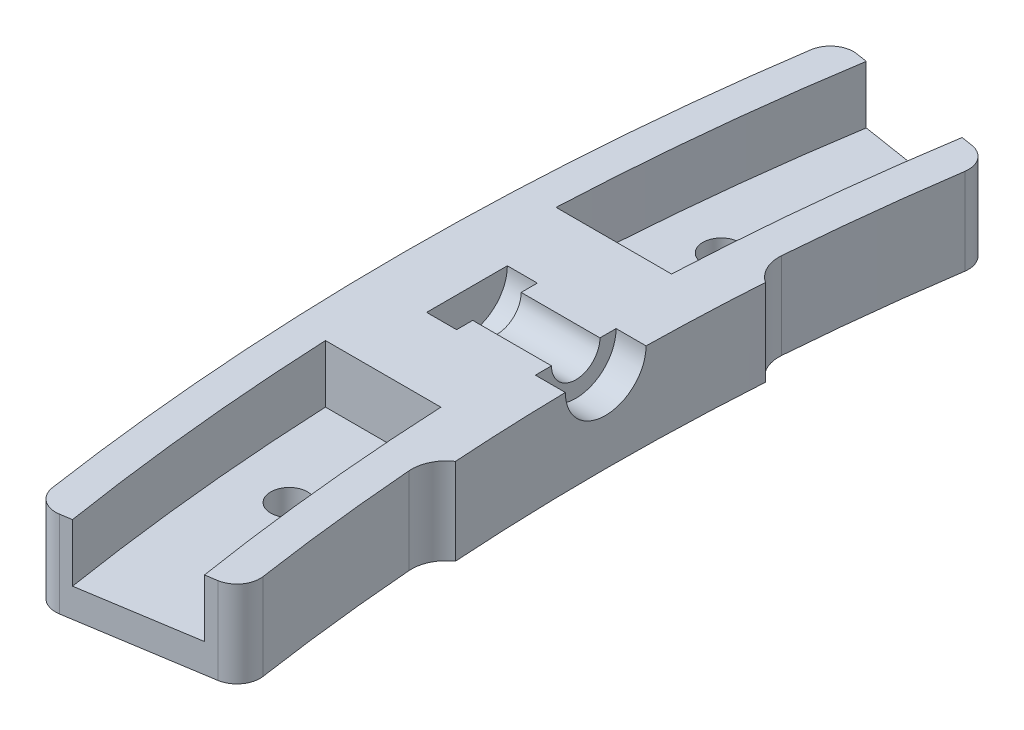
ISO-10303-21;
HEADER;
FILE_DESCRIPTION(('STEP AP214'),'2;1');
FILE_NAME('part.step','',(''),(''),'','','');
FILE_SCHEMA(('AUTOMOTIVE_DESIGN { 1 0 10303 214 1 1 1 1 }'));
ENDSEC;
DATA;
#1=APPLICATION_CONTEXT('core data for automotive mechanical design processes');
#2=APPLICATION_PROTOCOL_DEFINITION('international standard','automotive_design',2000,#1);
#3=PRODUCT_CONTEXT('',#1,'mechanical');
#4=PRODUCT('Part','Part','',(#3));
#5=PRODUCT_RELATED_PRODUCT_CATEGORY('part','',(#4));
#6=PRODUCT_DEFINITION_FORMATION('','',#4);
#7=PRODUCT_DEFINITION_CONTEXT('part definition',#1,'design');
#8=PRODUCT_DEFINITION('design','',#6,#7);
#9=PRODUCT_DEFINITION_SHAPE('','',#8);
#10=(LENGTH_UNIT() NAMED_UNIT(*) SI_UNIT(.MILLI.,.METRE.));
#11=(NAMED_UNIT(*) PLANE_ANGLE_UNIT() SI_UNIT($,.RADIAN.));
#12=(NAMED_UNIT(*) SI_UNIT($,.STERADIAN.) SOLID_ANGLE_UNIT());
#13=UNCERTAINTY_MEASURE_WITH_UNIT(LENGTH_MEASURE(1.E-05),#10,'distance_accuracy_value','');
#14=(GEOMETRIC_REPRESENTATION_CONTEXT(3) GLOBAL_UNCERTAINTY_ASSIGNED_CONTEXT((#13)) GLOBAL_UNIT_ASSIGNED_CONTEXT((#10,
#11,#12)) REPRESENTATION_CONTEXT('',''));
#15=CARTESIAN_POINT('',(0.,0.,0.));
#16=DIRECTION('',(0.,0.,1.));
#17=DIRECTION('',(1.,0.,0.));
#18=AXIS2_PLACEMENT_3D('',#15,#16,#17);
#19=CARTESIAN_POINT('',(0.,10.0000000000001,0.));
#20=DIRECTION('',(0.,-1.00000000000001,0.));
#21=DIRECTION('',(0.,0.,-1.00000000000001));
#22=AXIS2_PLACEMENT_3D('',#19,#20,#21);
#23=CYLINDRICAL_SURFACE('',#22,207.);
#24=DIRECTION('',(0.,-1.00000000000001,0.));
#25=VECTOR('',#24,1.);
#26=CARTESIAN_POINT('',(-206.36838062626,10.0000000000001,-16.1583253369565));
#27=LINE('',#26,#25);
#28=CARTESIAN_POINT('',(-206.36838062626,10.0000000000001,-16.1583253369565));
#29=VERTEX_POINT('',#28);
#30=CARTESIAN_POINT('',(-206.36838062626,2.50000000000003,-16.1583253369564));
#31=VERTEX_POINT('',#30);
#32=EDGE_CURVE('E468',#29,#31,#27,.T.);
#33=ORIENTED_EDGE('',*,*,#32,.T.);
#34=CARTESIAN_POINT('',(0.,2.50000000000001,0.));
#35=DIRECTION('',(0.,1.00000000000001,0.));
#36=DIRECTION('',(0.,0.,-1.00000000000001));
#37=AXIS2_PLACEMENT_3D('',#34,#35,#36);
#38=CIRCLE('',#37,207.);
#39=CARTESIAN_POINT('',(-204.752000140416,2.50000000000001,-30.4239780189755));
#40=VERTEX_POINT('',#39);
#41=EDGE_CURVE('E374',#40,#31,#38,.T.);
#42=ORIENTED_EDGE('',*,*,#41,.F.);
#43=DIRECTION('',(0.,-1.00000000000001,0.));
#44=VECTOR('',#43,1.);
#45=CARTESIAN_POINT('',(-204.752000140416,10.0000000000001,-30.4239780189755));
#46=LINE('',#45,#44);
#47=CARTESIAN_POINT('',(-204.752000140416,10.0000000000001,-30.4239780189755));
#48=VERTEX_POINT('',#47);
#49=EDGE_CURVE('E349',#40,#48,#46,.F.);
#50=ORIENTED_EDGE('',*,*,#49,.T.);
#51=CARTESIAN_POINT('',(0.,10.0000000000001,0.));
#52=DIRECTION('',(0.,1.00000000000001,0.));
#53=DIRECTION('',(0.,0.,1.00000000000001));
#54=AXIS2_PLACEMENT_3D('',#51,#52,#53);
#55=CIRCLE('',#54,207.);
#56=EDGE_CURVE('E460',#48,#29,#55,.T.);
#57=ORIENTED_EDGE('',*,*,#56,.T.);
#58=EDGE_LOOP('',(#33,#42,#50,#57));
#59=FACE_BOUND('',#58,.T.);
#60=ADVANCED_FACE('F35',(#59),#23,.F.);
#61=DIRECTION('',(0.,-1.00000000000001,0.));
#62=VECTOR('',#61,1.);
#63=CARTESIAN_POINT('',(-204.752000140416,10.0000000000001,30.4239780189756));
#64=LINE('',#63,#62);
#65=CARTESIAN_POINT('',(-204.752000140416,10.0000000000001,30.4239780189756));
#66=VERTEX_POINT('',#65);
#67=CARTESIAN_POINT('',(-204.752000140416,2.50000000000002,30.4239780189755));
#68=VERTEX_POINT('',#67);
#69=EDGE_CURVE('E342',#66,#68,#64,.T.);
#70=ORIENTED_EDGE('',*,*,#69,.T.);
#71=CARTESIAN_POINT('',(0.,2.50000000000001,0.));
#72=DIRECTION('',(0.,1.00000000000001,0.));
#73=DIRECTION('',(0.,0.,-1.00000000000001));
#74=AXIS2_PLACEMENT_3D('',#71,#72,#73);
#75=CIRCLE('',#74,207.);
#76=CARTESIAN_POINT('',(-206.36838062626,2.50000000000004,16.1583253369557));
#77=VERTEX_POINT('',#76);
#78=EDGE_CURVE('E359',#77,#68,#75,.T.);
#79=ORIENTED_EDGE('',*,*,#78,.F.);
#80=DIRECTION('',(0.,-1.00000000000001,0.));
#81=VECTOR('',#80,1.);
#82=CARTESIAN_POINT('',(-206.36838062626,10.0000000000001,16.1583253369557));
#83=LINE('',#82,#81);
#84=CARTESIAN_POINT('',(-206.36838062626,10.0000000000001,16.1583253369557));
#85=VERTEX_POINT('',#84);
#86=EDGE_CURVE('E472',#77,#85,#83,.F.);
#87=ORIENTED_EDGE('',*,*,#86,.T.);
#88=EDGE_CURVE('E459',#85,#66,#55,.T.);
#89=ORIENTED_EDGE('',*,*,#88,.T.);
#90=EDGE_LOOP('',(#70,#79,#87,#89));
#91=FACE_BOUND('',#90,.T.);
#92=ADVANCED_FACE('F290',(#91),#23,.F.);
#93=CARTESIAN_POINT('',(0.,10.0000000000001,0.));
#94=DIRECTION('',(0.156434465040234,0.,0.987688340595146));
#95=DIRECTION('',(0.987688340595137,0.,-0.156434465040235));
#96=AXIS2_PLACEMENT_3D('',#93,#94,#95);
#97=PLANE('',#96);
#98=DIRECTION('',(0.,1.00000000000001,0.));
#99=VECTOR('',#98,1.);
#100=CARTESIAN_POINT('',(-218.270184732485,0.,34.5706010483888));
#101=LINE('',#100,#99);
#102=CARTESIAN_POINT('',(-218.270184732485,10.0000000000001,34.5706010483888));
#103=VERTEX_POINT('',#102);
#104=CARTESIAN_POINT('',(-218.270184732485,2.50000000000003,34.5706010483887));
#105=VERTEX_POINT('',#104);
#106=EDGE_CURVE('E338',#103,#105,#101,.F.);
#107=ORIENTED_EDGE('',*,*,#106,.T.);
#108=DIRECTION('',(-0.987688340595137,0.,0.156434465040234));
#109=VECTOR('',#108,1.);
#110=CARTESIAN_POINT('',(-206.417411404929,2.50000000000003,32.6933061786101));
#111=LINE('',#110,#109);
#112=CARTESIAN_POINT('',(-206.417411404929,2.50000000000003,32.6933061786101));
#113=VERTEX_POINT('',#112);
#114=EDGE_CURVE('E362',#113,#105,#111,.T.);
#115=ORIENTED_EDGE('',*,*,#114,.F.);
#116=DIRECTION('',(0.,-1.00000000000001,0.));
#117=VECTOR('',#116,1.);
#118=CARTESIAN_POINT('',(-206.417411404929,10.0000000000001,32.6933061786101));
#119=LINE('',#118,#117);
#120=CARTESIAN_POINT('',(-206.417411404929,10.0000000000001,32.6933061786101));
#121=VERTEX_POINT('',#120);
#122=EDGE_CURVE('E331',#113,#121,#119,.F.);
#123=ORIENTED_EDGE('',*,*,#122,.T.);
#124=DIRECTION('',(-0.987688340595137,0.,0.156434465040235));
#125=VECTOR('',#124,1.);
#126=CARTESIAN_POINT('',(0.,10.0000000000001,0.));
#127=LINE('',#126,#125);
#128=CARTESIAN_POINT('',(-207.414551524979,10.0000000000001,32.8512376584494));
#129=VERTEX_POINT('',#128);
#130=EDGE_CURVE('E457',#121,#129,#127,.T.);
#131=ORIENTED_EDGE('',*,*,#130,.T.);
#132=DIRECTION('',(0.,1.00000000000001,0.));
#133=VECTOR('',#132,1.);
#134=CARTESIAN_POINT('',(-207.414551524979,5.00000000000004,32.8512376584493));
#135=LINE('',#134,#133);
#136=CARTESIAN_POINT('',(-207.414551524979,5.00000000000004,32.8512376584493));
#137=VERTEX_POINT('',#136);
#138=EDGE_CURVE('E449',#137,#129,#135,.T.);
#139=ORIENTED_EDGE('',*,*,#138,.F.);
#140=DIRECTION('',(0.987688340595137,0.,-0.156434465040235));
#141=VECTOR('',#140,1.);
#142=CARTESIAN_POINT('',(0.,5.00000000000004,0.));
#143=LINE('',#142,#141);
#144=CARTESIAN_POINT('',(-217.29143493093,5.00000000000005,34.4155823088518));
#145=VERTEX_POINT('',#144);
#146=EDGE_CURVE('E437',#145,#137,#143,.T.);
#147=ORIENTED_EDGE('',*,*,#146,.F.);
#148=DIRECTION('',(0.,1.00000000000001,0.));
#149=VECTOR('',#148,1.);
#150=CARTESIAN_POINT('',(-217.29143493093,5.00000000000005,34.4155823088518));
#151=LINE('',#150,#149);
#152=CARTESIAN_POINT('',(-217.29143493093,10.0000000000001,34.4155823088517));
#153=VERTEX_POINT('',#152);
#154=EDGE_CURVE('E452',#145,#153,#151,.T.);
#155=ORIENTED_EDGE('',*,*,#154,.T.);
#156=EDGE_CURVE('E423',#153,#103,#127,.T.);
#157=ORIENTED_EDGE('',*,*,#156,.T.);
#158=EDGE_LOOP('',(#107,#115,#123,#131,#139,#147,#155,#157));
#159=FACE_BOUND('',#158,.T.);
#160=ADVANCED_FACE('F296',(#159),#97,.T.);
#161=CARTESIAN_POINT('',(0.,10.0000000000001,0.));
#162=DIRECTION('',(0.156434465040234,0.,-0.987688340595144));
#163=DIRECTION('',(-0.987688340595137,0.,-0.156434465040235));
#164=AXIS2_PLACEMENT_3D('',#161,#162,#163);
#165=PLANE('',#164);
#166=DIRECTION('',(0.,-1.00000000000001,0.));
#167=VECTOR('',#166,1.);
#168=CARTESIAN_POINT('',(-206.417411404929,10.0000000000001,-32.69330617861));
#169=LINE('',#168,#167);
#170=CARTESIAN_POINT('',(-206.417411404929,10.0000000000001,-32.6933061786101));
#171=VERTEX_POINT('',#170);
#172=CARTESIAN_POINT('',(-206.417411404929,2.50000000000002,-32.6933061786101));
#173=VERTEX_POINT('',#172);
#174=EDGE_CURVE('E484',#171,#173,#169,.T.);
#175=ORIENTED_EDGE('',*,*,#174,.T.);
#176=DIRECTION('',(0.987688340595137,0.,0.156434465040233));
#177=VECTOR('',#176,1.);
#178=CARTESIAN_POINT('',(-218.270184732485,2.50000000000002,-34.5706010483886));
#179=LINE('',#178,#177);
#180=CARTESIAN_POINT('',(-218.270184732485,2.50000000000002,-34.5706010483886));
#181=VERTEX_POINT('',#180);
#182=EDGE_CURVE('E370',#181,#173,#179,.T.);
#183=ORIENTED_EDGE('',*,*,#182,.F.);
#184=DIRECTION('',(0.,1.00000000000001,0.));
#185=VECTOR('',#184,1.);
#186=CARTESIAN_POINT('',(-218.270184732485,10.0000000000001,-34.5706010483887));
#187=LINE('',#186,#185);
#188=CARTESIAN_POINT('',(-218.270184732485,10.0000000000001,-34.5706010483887));
#189=VERTEX_POINT('',#188);
#190=EDGE_CURVE('E487',#181,#189,#187,.T.);
#191=ORIENTED_EDGE('',*,*,#190,.T.);
#192=DIRECTION('',(0.987688340595137,0.,0.156434465040235));
#193=VECTOR('',#192,1.);
#194=CARTESIAN_POINT('',(0.,10.0000000000001,0.));
#195=LINE('',#194,#193);
#196=CARTESIAN_POINT('',(-217.29143493093,10.0000000000001,-34.4155823088517));
#197=VERTEX_POINT('',#196);
#198=EDGE_CURVE('E463',#189,#197,#195,.T.);
#199=ORIENTED_EDGE('',*,*,#198,.T.);
#200=DIRECTION('',(0.,1.00000000000001,0.));
#201=VECTOR('',#200,1.);
#202=CARTESIAN_POINT('',(-217.291434930931,5.00000000000004,-34.4155823088518));
#203=LINE('',#202,#201);
#204=CARTESIAN_POINT('',(-217.291434930931,5.00000000000004,-34.4155823088518));
#205=VERTEX_POINT('',#204);
#206=EDGE_CURVE('E410',#205,#197,#203,.T.);
#207=ORIENTED_EDGE('',*,*,#206,.F.);
#208=DIRECTION('',(-0.987688340595137,0.,-0.156434465040235));
#209=VECTOR('',#208,1.);
#210=CARTESIAN_POINT('',(0.,5.00000000000004,0.));
#211=LINE('',#210,#209);
#212=CARTESIAN_POINT('',(-207.414551524979,5.00000000000004,-32.8512376584494));
#213=VERTEX_POINT('',#212);
#214=EDGE_CURVE('E399',#213,#205,#211,.T.);
#215=ORIENTED_EDGE('',*,*,#214,.F.);
#216=DIRECTION('',(0.,1.00000000000001,0.));
#217=VECTOR('',#216,1.);
#218=CARTESIAN_POINT('',(-207.414551524979,5.00000000000004,-32.8512376584494));
#219=LINE('',#218,#217);
#220=CARTESIAN_POINT('',(-207.414551524979,10.0000000000001,-32.8512376584494));
#221=VERTEX_POINT('',#220);
#222=EDGE_CURVE('E420',#213,#221,#219,.T.);
#223=ORIENTED_EDGE('',*,*,#222,.T.);
#224=EDGE_CURVE('E462',#221,#171,#195,.T.);
#225=ORIENTED_EDGE('',*,*,#224,.T.);
#226=EDGE_LOOP('',(#175,#183,#191,#199,#207,#215,#223,#225));
#227=FACE_BOUND('',#226,.T.);
#228=ADVANCED_FACE('F301',(#227),#165,.T.);
#229=CARTESIAN_POINT('',(0.,10.0000000000001,0.));
#230=DIRECTION('',(0.,-1.00000000000001,0.));
#231=DIRECTION('',(0.,0.,-1.00000000000001));
#232=AXIS2_PLACEMENT_3D('',#229,#230,#231);
#233=CYLINDRICAL_SURFACE('',#232,223.);
#234=CARTESIAN_POINT('',(0.,2.50000000000001,0.));
#235=DIRECTION('',(0.,-1.00000000000001,0.));
#236=DIRECTION('',(0.,0.,-1.00000000000001));
#237=AXIS2_PLACEMENT_3D('',#234,#235,#236);
#238=CIRCLE('',#237,223.);
#239=CARTESIAN_POINT('',(-220.561180845032,2.50000000000002,32.8902037732365));
#240=VERTEX_POINT('',#239);
#241=CARTESIAN_POINT('',(-220.561180845032,2.50000000000002,-32.8902037732363));
#242=VERTEX_POINT('',#241);
#243=EDGE_CURVE('E366',#240,#242,#238,.T.);
#244=ORIENTED_EDGE('',*,*,#243,.F.);
#245=DIRECTION('',(0.,-1.00000000000001,0.));
#246=VECTOR('',#245,1.);
#247=CARTESIAN_POINT('',(-220.561180845032,10.0000000000001,32.8902037732364));
#248=LINE('',#247,#246);
#249=CARTESIAN_POINT('',(-220.561180845032,10.0000000000001,32.8902037732364));
#250=VERTEX_POINT('',#249);
#251=EDGE_CURVE('E479',#240,#250,#248,.F.);
#252=ORIENTED_EDGE('',*,*,#251,.T.);
#253=CARTESIAN_POINT('',(0.,10.0000000000001,0.));
#254=DIRECTION('',(0.,1.00000000000001,0.));
#255=DIRECTION('',(0.,0.,1.00000000000001));
#256=AXIS2_PLACEMENT_3D('',#253,#254,#255);
#257=CIRCLE('',#256,223.);
#258=CARTESIAN_POINT('',(-220.561180845032,10.0000000000001,-32.8902037732363));
#259=VERTEX_POINT('',#258);
#260=EDGE_CURVE('E465',#259,#250,#257,.T.);
#261=ORIENTED_EDGE('',*,*,#260,.F.);
#262=DIRECTION('',(0.,-1.00000000000001,0.));
#263=VECTOR('',#262,1.);
#264=CARTESIAN_POINT('',(-220.561180845032,10.0000000000001,-32.8902037732363));
#265=LINE('',#264,#263);
#266=EDGE_CURVE('E481',#259,#242,#265,.T.);
#267=ORIENTED_EDGE('',*,*,#266,.T.);
#268=EDGE_LOOP('',(#244,#252,#261,#267));
#269=FACE_BOUND('',#268,.T.);
#270=ADVANCED_FACE('F503',(#269),#233,.T.);
#271=CARTESIAN_POINT('',(-214.181860089725,0.,-18.7384846907466));
#272=DIRECTION('',(0.,-1.00000000000001,0.));
#273=DIRECTION('',(0.,0.,-1.00000000000001));
#274=AXIS2_PLACEMENT_3D('',#271,#272,#273);
#275=CYLINDRICAL_SURFACE('',#274,1.59999999999999);
#276=CARTESIAN_POINT('',(-214.181860089725,5.00000000000004,-18.7384846907466));
#277=DIRECTION('',(0.,1.00000000000001,0.));
#278=DIRECTION('',(0.,0.,1.00000000000001));
#279=AXIS2_PLACEMENT_3D('',#276,#277,#278);
#280=CIRCLE('',#279,1.59999999999999);
#281=CARTESIAN_POINT('',(-214.181860089725,5.00000000000004,-17.1384846907466));
#282=VERTEX_POINT('',#281);
#283=EDGE_CURVE('E395',#282,#282,#280,.T.);
#284=ORIENTED_EDGE('',*,*,#283,.T.);
#285=EDGE_LOOP('',(#284));
#286=FACE_BOUND('',#285,.T.);
#287=CARTESIAN_POINT('',(-214.181860089725,2.50000000000002,-18.7384846907466));
#288=DIRECTION('',(0.,-1.00000000000001,0.));
#289=DIRECTION('',(0.,0.,-1.00000000000001));
#290=AXIS2_PLACEMENT_3D('',#287,#288,#289);
#291=CIRCLE('',#290,1.59999999999999);
#292=CARTESIAN_POINT('',(-214.181860089725,2.50000000000002,-20.3384846907466));
#293=VERTEX_POINT('',#292);
#294=EDGE_CURVE('E381',#293,#293,#291,.F.);
#295=ORIENTED_EDGE('',*,*,#294,.F.);
#296=EDGE_LOOP('',(#295));
#297=FACE_BOUND('',#296,.T.);
#298=ADVANCED_FACE('F556',(#286,#297),#275,.F.);
#299=CARTESIAN_POINT('',(-214.181860089725,0.,18.7384846907467));
#300=DIRECTION('',(0.,-1.00000000000001,0.));
#301=DIRECTION('',(0.,0.,-1.00000000000001));
#302=AXIS2_PLACEMENT_3D('',#299,#300,#301);
#303=CYLINDRICAL_SURFACE('',#302,1.59999999999999);
#304=CARTESIAN_POINT('',(-214.181860089725,5.00000000000004,18.7384846907467));
#305=DIRECTION('',(0.,1.00000000000001,0.));
#306=DIRECTION('',(0.,0.,1.00000000000001));
#307=AXIS2_PLACEMENT_3D('',#304,#305,#306);
#308=CIRCLE('',#307,1.59999999999999);
#309=CARTESIAN_POINT('',(-214.181860089725,5.00000000000004,20.3384846907467));
#310=VERTEX_POINT('',#309);
#311=EDGE_CURVE('E394',#310,#310,#308,.T.);
#312=ORIENTED_EDGE('',*,*,#311,.T.);
#313=EDGE_LOOP('',(#312));
#314=FACE_BOUND('',#313,.T.);
#315=CARTESIAN_POINT('',(-214.181860089725,2.50000000000001,18.7384846907467));
#316=DIRECTION('',(0.,-1.00000000000001,0.));
#317=DIRECTION('',(0.,0.,-1.00000000000001));
#318=AXIS2_PLACEMENT_3D('',#315,#316,#317);
#319=CIRCLE('',#318,1.59999999999999);
#320=CARTESIAN_POINT('',(-214.181860089725,2.50000000000001,17.1384846907467));
#321=VERTEX_POINT('',#320);
#322=EDGE_CURVE('E378',#321,#321,#319,.F.);
#323=ORIENTED_EDGE('',*,*,#322,.F.);
#324=EDGE_LOOP('',(#323));
#325=FACE_BOUND('',#324,.T.);
#326=ADVANCED_FACE('F561',(#314,#325),#303,.F.);
#327=CARTESIAN_POINT('',(0.,10.0000000000001,0.));
#328=DIRECTION('',(0.,-1.00000000000001,0.));
#329=DIRECTION('',(0.,0.,-1.00000000000001));
#330=AXIS2_PLACEMENT_3D('',#327,#328,#329);
#331=CYLINDRICAL_SURFACE('',#330,205.5);
#332=CARTESIAN_POINT('',(0.,10.0000000000001,0.));
#333=DIRECTION('',(0.,-1.00000000000001,0.));
#334=DIRECTION('',(0.,0.,1.00000000000001));
#335=AXIS2_PLACEMENT_3D('',#332,#333,#334);
#336=CIRCLE('',#335,205.5);
#337=CARTESIAN_POINT('',(-205.470192485431,10.0000000000001,-3.50000000000002));
#338=VERTEX_POINT('',#337);
#339=CARTESIAN_POINT('',(-205.060008725533,10.0000000000001,-13.4403430567946));
#340=VERTEX_POINT('',#339);
#341=EDGE_CURVE('E384',#338,#340,#336,.T.);
#342=ORIENTED_EDGE('',*,*,#341,.F.);
#343=CARTESIAN_POINT('',(-205.470192485431,10.0000000000001,-3.50000000000002));
#344=CARTESIAN_POINT('',(-205.47019179769,9.90156701657175,-3.50000943872722));
#345=CARTESIAN_POINT('',(-205.470263204359,9.80313851600359,-3.49584758310926));
#346=CARTESIAN_POINT('',(-205.470545128519,9.60698584852229,-3.47925433272638));
#347=CARTESIAN_POINT('',(-205.470755639276,9.50926164773988,-3.4668233383371));
#348=CARTESIAN_POINT('',(-205.471310497863,9.31527204189038,-3.43377656011316));
#349=CARTESIAN_POINT('',(-205.471654750745,9.21900565213275,-3.41316658261365));
#350=CARTESIAN_POINT('',(-205.472466722473,9.0285750510071,-3.36392915285146));
#351=CARTESIAN_POINT('',(-205.472934439833,8.93441081434757,-3.33530179710408));
#352=CARTESIAN_POINT('',(-205.474504712896,8.65598338556604,-3.2376263141778));
#353=CARTESIAN_POINT('',(-205.475774642457,8.47570279913914,-3.15677061178356));
#354=CARTESIAN_POINT('',(-205.478616597242,8.13141074648078,-2.96600012431515));
#355=CARTESIAN_POINT('',(-205.480188563762,7.96739612813592,-2.85609098457524));
#356=CARTESIAN_POINT('',(-205.483458007803,7.66009847995341,-2.61027861440498));
#357=CARTESIAN_POINT('',(-205.485155499411,7.51681778211797,-2.47437246400309));
#358=CARTESIAN_POINT('',(-205.488484701828,7.25509076189467,-2.18041643899056));
#359=CARTESIAN_POINT('',(-205.490116402581,7.13664822463138,-2.02236319546444));
#360=CARTESIAN_POINT('',(-205.493129830823,6.92797608819849,-1.6886091100184));
#361=CARTESIAN_POINT('',(-205.494511554147,6.83774695910762,-1.51290797412192));
#362=CARTESIAN_POINT('',(-205.496869123008,6.68807425910176,-1.14886006638418));
#363=CARTESIAN_POINT('',(-205.49784499475,6.62862870053271,-0.960514111889299));
#364=CARTESIAN_POINT('',(-205.499280908388,6.54220585728782,-0.576528295989687));
#365=CARTESIAN_POINT('',(-205.499740990452,6.51522604419841,-0.380889003809503));
#366=CARTESIAN_POINT('',(-205.50009359534,6.49449287787389,0.012147289889962));
#367=CARTESIAN_POINT('',(-205.499986105514,6.5007402651164,0.209544330483299));
#368=CARTESIAN_POINT('',(-205.499215701122,6.54628298424245,0.600464500041599));
#369=CARTESIAN_POINT('',(-205.498552849708,6.58557455855864,0.793988066910928));
#370=CARTESIAN_POINT('',(-205.496746522394,6.69608442895513,1.17169096079018));
#371=CARTESIAN_POINT('',(-205.495603047853,6.76730263481948,1.35587031420266));
#372=CARTESIAN_POINT('',(-205.492964243791,6.93965005625294,1.70967296030796));
#373=CARTESIAN_POINT('',(-205.49146888652,7.04078163114977,1.87929510348229));
#374=CARTESIAN_POINT('',(-205.488294988736,7.27007828154068,2.19914639630217));
#375=CARTESIAN_POINT('',(-205.486616457068,7.39824205222423,2.34937648141428));
#376=CARTESIAN_POINT('',(-205.483265329395,7.67796514344104,2.62619026217676));
#377=CARTESIAN_POINT('',(-205.481592733349,7.82952429621009,2.75277412737568));
#378=CARTESIAN_POINT('',(-205.478441487921,8.15180339666959,2.97874163067494));
#379=CARTESIAN_POINT('',(-205.476962900275,8.3225294116307,3.07811662137889));
#380=CARTESIAN_POINT('',(-205.474366236861,8.6783174428036,3.24684033187836));
#381=CARTESIAN_POINT('',(-205.473248381718,8.86338814680867,3.31617068510003));
#382=CARTESIAN_POINT('',(-205.471502206916,9.24240058207597,3.42266927120822));
#383=CARTESIAN_POINT('',(-205.470873139885,9.4363282880281,3.4598866155405));
#384=CARTESIAN_POINT('',(-205.470412654252,9.69295529264857,3.48705255884534));
#385=CARTESIAN_POINT('',(-205.470330133082,9.75431769754791,3.49191041060893));
#386=CARTESIAN_POINT('',(-205.470220122299,9.87711178029487,3.49837969921849));
#387=CARTESIAN_POINT('',(-205.4701925419,9.9385431757506,3.49999649168429));
#388=CARTESIAN_POINT('',(-205.470192485431,10.0000000000001,3.50000000000002));
#389=B_SPLINE_CURVE_WITH_KNOTS('',3,(#343,#344,#345,#346,#347,#348,#349,#350,#351,#352,#353,
#354,#355,#356,#357,#358,#359,#360,#361,#362,#363,#364,#365,#366,#367,#368,#369,#370,#371,#372,
#373,#374,#375,#376,#377,#378,#379,#380,#381,#382,#383,#384,#385,#386,#387,#388),.UNSPECIFIED.,
.F.,.F.,(4,2,2,2,2,2,2,2,2,2,2,2,2,2,2,2,2,2,2,2,2,2,4),(0.,0.295202888349661,0.590391484588648,
0.885370897536078,1.18034675959726,1.7700500147659,2.35963876961011,2.94929378570089,
3.53903859501012,4.12879322985061,4.71850978027192,5.30818040093466,5.89786416263025,
6.48748087843682,7.07709592815796,7.66675749441305,8.25639060494743,8.84601948752169,
9.43583554622602,10.0260116582365,10.6152835872416,10.7998872395627,10.9841855952015),.UNSPECIFIED.);
#390=CARTESIAN_POINT('',(-205.470192485431,10.0000000000001,3.50000000000002));
#391=VERTEX_POINT('',#390);
#392=EDGE_CURVE('E243',#338,#391,#389,.T.);
#393=ORIENTED_EDGE('',*,*,#392,.T.);
#394=CARTESIAN_POINT('',(-205.060008725533,10.0000000000001,13.4403430567947));
#395=VERTEX_POINT('',#394);
#396=EDGE_CURVE('E385',#395,#391,#336,.T.);
#397=ORIENTED_EDGE('',*,*,#396,.F.);
#398=DIRECTION('',(0.,-1.00000000000001,0.));
#399=VECTOR('',#398,1.);
#400=CARTESIAN_POINT('',(-205.060008725533,10.0000000000001,13.4403430567947));
#401=LINE('',#400,#399);
#402=CARTESIAN_POINT('',(-205.060008725533,2.50000000000002,13.4403430567946));
#403=VERTEX_POINT('',#402);
#404=EDGE_CURVE('E388',#395,#403,#401,.T.);
#405=ORIENTED_EDGE('',*,*,#404,.T.);
#406=CARTESIAN_POINT('',(0.,2.50000000000001,0.));
#407=DIRECTION('',(0.,1.00000000000001,0.));
#408=DIRECTION('',(0.,0.,-1.00000000000001));
#409=AXIS2_PLACEMENT_3D('',#406,#407,#408);
#410=CIRCLE('',#409,205.5);
#411=CARTESIAN_POINT('',(-205.060008725533,2.50000000000001,-13.4403430567953));
#412=VERTEX_POINT('',#411);
#413=EDGE_CURVE('E354',#412,#403,#410,.T.);
#414=ORIENTED_EDGE('',*,*,#413,.F.);
#415=DIRECTION('',(0.,-1.00000000000001,0.));
#416=VECTOR('',#415,1.);
#417=CARTESIAN_POINT('',(-205.060008725533,10.0000000000001,-13.4403430567946));
#418=LINE('',#417,#416);
#419=EDGE_CURVE('E391',#340,#412,#418,.T.);
#420=ORIENTED_EDGE('',*,*,#419,.F.);
#421=EDGE_LOOP('',(#342,#393,#397,#405,#414,#420));
#422=FACE_BOUND('',#421,.T.);
#423=ADVANCED_FACE('F259',(#422),#331,.F.);
#424=CARTESIAN_POINT('',(-203.377534530228,10.0000000000001,-15.9241467088846));
#425=DIRECTION('',(0.,-1.00000000000001,0.));
#426=DIRECTION('',(0.,0.,-1.00000000000001));
#427=AXIS2_PLACEMENT_3D('',#424,#425,#426);
#428=CYLINDRICAL_SURFACE('',#427,3.);
#429=CARTESIAN_POINT('',(-203.377534530228,2.50000000000002,-15.9241467088846));
#430=DIRECTION('',(0.,1.00000000000001,0.));
#431=DIRECTION('',(0.,0.,-1.00000000000001));
#432=AXIS2_PLACEMENT_3D('',#429,#430,#431);
#433=CIRCLE('',#432,3.00000000000008);
#434=EDGE_CURVE('E376',#31,#412,#433,.T.);
#435=ORIENTED_EDGE('',*,*,#434,.F.);
#436=ORIENTED_EDGE('',*,*,#32,.F.);
#437=CARTESIAN_POINT('',(-203.377534530228,10.0000000000001,-15.9241467088846));
#438=DIRECTION('',(0.,1.00000000000001,0.));
#439=DIRECTION('',(0.,0.,1.00000000000001));
#440=AXIS2_PLACEMENT_3D('',#437,#438,#439);
#441=CIRCLE('',#440,3.);
#442=EDGE_CURVE('E474',#340,#29,#441,.F.);
#443=ORIENTED_EDGE('',*,*,#442,.F.);
#444=ORIENTED_EDGE('',*,*,#419,.T.);
#445=EDGE_LOOP('',(#435,#436,#443,#444));
#446=FACE_BOUND('',#445,.T.);
#447=ADVANCED_FACE('F306',(#446),#428,.F.);
#448=CARTESIAN_POINT('',(-203.377534530228,10.0000000000001,15.9241467088838));
#449=DIRECTION('',(0.,-1.00000000000001,0.));
#450=DIRECTION('',(0.,0.,-1.00000000000001));
#451=AXIS2_PLACEMENT_3D('',#448,#449,#450);
#452=CYLINDRICAL_SURFACE('',#451,3.);
#453=CARTESIAN_POINT('',(-203.377534530228,2.50000000000003,15.9241467088838));
#454=DIRECTION('',(0.,1.00000000000001,0.));
#455=DIRECTION('',(0.,0.,-1.00000000000001));
#456=AXIS2_PLACEMENT_3D('',#453,#454,#455);
#457=CIRCLE('',#456,3.);
#458=EDGE_CURVE('E355',#403,#77,#457,.T.);
#459=ORIENTED_EDGE('',*,*,#458,.F.);
#460=ORIENTED_EDGE('',*,*,#404,.F.);
#461=CARTESIAN_POINT('',(-203.377534530228,10.0000000000001,15.9241467088838));
#462=DIRECTION('',(0.,1.00000000000001,0.));
#463=DIRECTION('',(0.,0.,1.00000000000001));
#464=AXIS2_PLACEMENT_3D('',#461,#462,#463);
#465=CIRCLE('',#464,3.);
#466=EDGE_CURVE('E477',#85,#395,#465,.F.);
#467=ORIENTED_EDGE('',*,*,#466,.F.);
#468=ORIENTED_EDGE('',*,*,#86,.F.);
#469=EDGE_LOOP('',(#459,#460,#467,#468));
#470=FACE_BOUND('',#469,.T.);
#471=ADVANCED_FACE('F309',(#470),#452,.F.);
#472=CARTESIAN_POINT('',(-218.583053662566,10.0000000000001,-32.5952243671984));
#473=DIRECTION('',(0.,-1.00000000000001,0.));
#474=DIRECTION('',(0.,0.,-1.00000000000001));
#475=AXIS2_PLACEMENT_3D('',#472,#473,#474);
#476=CYLINDRICAL_SURFACE('',#475,2.);
#477=ORIENTED_EDGE('',*,*,#190,.F.);
#478=CARTESIAN_POINT('',(-218.583053662566,2.50000000000002,-32.5952243671984));
#479=DIRECTION('',(0.,-1.00000000000001,0.));
#480=DIRECTION('',(0.,0.,-1.00000000000001));
#481=AXIS2_PLACEMENT_3D('',#478,#479,#480);
#482=CIRCLE('',#481,1.99999999999997);
#483=EDGE_CURVE('E368',#242,#181,#482,.T.);
#484=ORIENTED_EDGE('',*,*,#483,.F.);
#485=ORIENTED_EDGE('',*,*,#266,.F.);
#486=CARTESIAN_POINT('',(-218.583053662566,10.0000000000001,-32.5952243671984));
#487=DIRECTION('',(0.,1.00000000000001,0.));
#488=DIRECTION('',(0.,0.,1.00000000000001));
#489=AXIS2_PLACEMENT_3D('',#486,#487,#488);
#490=CIRCLE('',#489,2.);
#491=EDGE_CURVE('E339',#189,#259,#490,.T.);
#492=ORIENTED_EDGE('',*,*,#491,.F.);
#493=EDGE_LOOP('',(#477,#484,#485,#492));
#494=FACE_BOUND('',#493,.T.);
#495=ADVANCED_FACE('F313',(#494),#476,.T.);
#496=CARTESIAN_POINT('',(-218.583053662566,10.0000000000001,32.5952243671984));
#497=DIRECTION('',(0.,-1.00000000000001,0.));
#498=DIRECTION('',(0.,0.,-1.00000000000001));
#499=AXIS2_PLACEMENT_3D('',#496,#497,#498);
#500=CYLINDRICAL_SURFACE('',#499,2.);
#501=ORIENTED_EDGE('',*,*,#251,.F.);
#502=CARTESIAN_POINT('',(-218.583053662566,2.50000000000003,32.5952243671984));
#503=DIRECTION('',(0.,-1.00000000000001,0.));
#504=DIRECTION('',(0.,0.,-1.00000000000001));
#505=AXIS2_PLACEMENT_3D('',#502,#503,#504);
#506=CIRCLE('',#505,1.99999999999998);
#507=EDGE_CURVE('E364',#105,#240,#506,.T.);
#508=ORIENTED_EDGE('',*,*,#507,.F.);
#509=ORIENTED_EDGE('',*,*,#106,.F.);
#510=CARTESIAN_POINT('',(-218.583053662566,10.0000000000001,32.5952243671984));
#511=DIRECTION('',(0.,1.00000000000001,0.));
#512=DIRECTION('',(0.,0.,1.00000000000001));
#513=AXIS2_PLACEMENT_3D('',#510,#511,#512);
#514=CIRCLE('',#513,2.);
#515=EDGE_CURVE('E344',#250,#103,#514,.T.);
#516=ORIENTED_EDGE('',*,*,#515,.F.);
#517=EDGE_LOOP('',(#501,#508,#509,#516));
#518=FACE_BOUND('',#517,.T.);
#519=ADVANCED_FACE('F317',(#518),#500,.T.);
#520=CARTESIAN_POINT('',(-206.730280335009,10.0000000000001,30.7179294974198));
#521=DIRECTION('',(0.,-1.00000000000001,0.));
#522=DIRECTION('',(0.,0.,-1.00000000000001));
#523=AXIS2_PLACEMENT_3D('',#520,#521,#522);
#524=CYLINDRICAL_SURFACE('',#523,2.);
#525=ORIENTED_EDGE('',*,*,#122,.F.);
#526=CARTESIAN_POINT('',(-206.730280335009,2.50000000000002,30.7179294974198));
#527=DIRECTION('',(0.,-1.00000000000001,0.));
#528=DIRECTION('',(0.,0.,-1.00000000000001));
#529=AXIS2_PLACEMENT_3D('',#526,#527,#528);
#530=CIRCLE('',#529,2.00000000000004);
#531=EDGE_CURVE('E333',#68,#113,#530,.T.);
#532=ORIENTED_EDGE('',*,*,#531,.F.);
#533=ORIENTED_EDGE('',*,*,#69,.F.);
#534=CARTESIAN_POINT('',(-206.730280335009,10.0000000000001,30.7179294974198));
#535=DIRECTION('',(0.,1.00000000000001,0.));
#536=DIRECTION('',(0.,0.,1.00000000000001));
#537=AXIS2_PLACEMENT_3D('',#534,#535,#536);
#538=CIRCLE('',#537,2.);
#539=EDGE_CURVE('E335',#121,#66,#538,.T.);
#540=ORIENTED_EDGE('',*,*,#539,.F.);
#541=EDGE_LOOP('',(#525,#532,#533,#540));
#542=FACE_BOUND('',#541,.T.);
#543=ADVANCED_FACE('F320',(#542),#524,.T.);
#544=CARTESIAN_POINT('',(-206.730280335009,10.0000000000001,-30.7179294974198));
#545=DIRECTION('',(0.,-1.00000000000001,0.));
#546=DIRECTION('',(0.,0.,-1.00000000000001));
#547=AXIS2_PLACEMENT_3D('',#544,#545,#546);
#548=CYLINDRICAL_SURFACE('',#547,2.);
#549=ORIENTED_EDGE('',*,*,#49,.F.);
#550=CARTESIAN_POINT('',(-206.730280335009,2.50000000000002,-30.7179294974198));
#551=DIRECTION('',(0.,-1.00000000000001,0.));
#552=DIRECTION('',(0.,0.,-1.00000000000001));
#553=AXIS2_PLACEMENT_3D('',#550,#551,#552);
#554=CIRCLE('',#553,2.00000000000002);
#555=EDGE_CURVE('E372',#173,#40,#554,.T.);
#556=ORIENTED_EDGE('',*,*,#555,.F.);
#557=ORIENTED_EDGE('',*,*,#174,.F.);
#558=CARTESIAN_POINT('',(-206.730280335009,10.0000000000001,-30.7179294974198));
#559=DIRECTION('',(0.,1.00000000000001,0.));
#560=DIRECTION('',(0.,0.,1.00000000000001));
#561=AXIS2_PLACEMENT_3D('',#558,#559,#560);
#562=CIRCLE('',#561,2.);
#563=EDGE_CURVE('E489',#48,#171,#562,.T.);
#564=ORIENTED_EDGE('',*,*,#563,.F.);
#565=EDGE_LOOP('',(#549,#556,#557,#564));
#566=FACE_BOUND('',#565,.T.);
#567=ADVANCED_FACE('F37',(#566),#548,.T.);
#568=CARTESIAN_POINT('',(0.,10.0000000000001,0.));
#569=DIRECTION('',(0.,1.00000000000001,0.));
#570=DIRECTION('',(0.,0.,1.00000000000001));
#571=AXIS2_PLACEMENT_3D('',#568,#569,#570);
#572=PLANE('',#571);
#573=DIRECTION('',(1.,0.,0.));
#574=VECTOR('',#573,1.);
#575=CARTESIAN_POINT('',(-220.839696961967,10.0000000000001,2.10000000000002));
#576=LINE('',#575,#574);
#577=CARTESIAN_POINT('',(-214.9,10.0000000000001,2.10000000000002));
#578=VERTEX_POINT('',#577);
#579=CARTESIAN_POINT('',(-208.070192485431,10.0000000000001,2.10000000000002));
#580=VERTEX_POINT('',#579);
#581=EDGE_CURVE('E50',#578,#580,#576,.T.);
#582=ORIENTED_EDGE('',*,*,#581,.F.);
#583=DIRECTION('',(0.,0.,-1.00000000000001));
#584=VECTOR('',#583,1.);
#585=CARTESIAN_POINT('',(-214.9,10.0000000000001,0.));
#586=LINE('',#585,#584);
#587=CARTESIAN_POINT('',(-214.9,10.0000000000001,3.50000000000005));
#588=VERTEX_POINT('',#587);
#589=EDGE_CURVE('E222',#588,#578,#586,.T.);
#590=ORIENTED_EDGE('',*,*,#589,.F.);
#591=DIRECTION('',(-1.,0.,0.));
#592=VECTOR('',#591,1.);
#593=CARTESIAN_POINT('',(-214.9,10.0000000000001,3.50000000000005));
#594=LINE('',#593,#592);
#595=CARTESIAN_POINT('',(-217.5,10.0000000000001,3.50000000000005));
#596=VERTEX_POINT('',#595);
#597=EDGE_CURVE('E231',#588,#596,#594,.T.);
#598=ORIENTED_EDGE('',*,*,#597,.T.);
#599=DIRECTION('',(0.,0.,-1.00000000000001));
#600=VECTOR('',#599,1.);
#601=CARTESIAN_POINT('',(-217.5,10.0000000000001,0.));
#602=LINE('',#601,#600);
#603=CARTESIAN_POINT('',(-217.5,10.0000000000001,-3.5));
#604=VERTEX_POINT('',#603);
#605=EDGE_CURVE('E351',#596,#604,#602,.T.);
#606=ORIENTED_EDGE('',*,*,#605,.T.);
#607=DIRECTION('',(-1.,0.,0.));
#608=VECTOR('',#607,1.);
#609=CARTESIAN_POINT('',(-214.9,10.0000000000001,-3.5));
#610=LINE('',#609,#608);
#611=CARTESIAN_POINT('',(-214.9,10.0000000000001,-3.5));
#612=VERTEX_POINT('',#611);
#613=EDGE_CURVE('E228',#604,#612,#610,.F.);
#614=ORIENTED_EDGE('',*,*,#613,.T.);
#615=CARTESIAN_POINT('',(-214.9,10.0000000000001,-2.10000000000001));
#616=VERTEX_POINT('',#615);
#617=EDGE_CURVE('E219',#616,#612,#586,.T.);
#618=ORIENTED_EDGE('',*,*,#617,.F.);
#619=DIRECTION('',(1.,0.,0.));
#620=VECTOR('',#619,1.);
#621=CARTESIAN_POINT('',(-220.839696961967,10.0000000000001,-2.10000000000001));
#622=LINE('',#621,#620);
#623=CARTESIAN_POINT('',(-208.070192485431,10.0000000000001,-2.10000000000001));
#624=VERTEX_POINT('',#623);
#625=EDGE_CURVE('E206',#624,#616,#622,.F.);
#626=ORIENTED_EDGE('',*,*,#625,.F.);
#627=DIRECTION('',(0.,0.,1.00000000000001));
#628=VECTOR('',#627,1.);
#629=CARTESIAN_POINT('',(-208.070192485431,10.0000000000001,0.));
#630=LINE('',#629,#628);
#631=CARTESIAN_POINT('',(-208.070192485431,10.0000000000001,-3.50000000000002));
#632=VERTEX_POINT('',#631);
#633=EDGE_CURVE('E236',#632,#624,#630,.T.);
#634=ORIENTED_EDGE('',*,*,#633,.F.);
#635=DIRECTION('',(-1.,0.,0.));
#636=VECTOR('',#635,1.);
#637=CARTESIAN_POINT('',(-217.5,10.0000000000001,-3.50000000000002));
#638=LINE('',#637,#636);
#639=EDGE_CURVE('E43',#338,#632,#638,.T.);
#640=ORIENTED_EDGE('',*,*,#639,.F.);
#641=ORIENTED_EDGE('',*,*,#341,.T.);
#642=ORIENTED_EDGE('',*,*,#442,.T.);
#643=ORIENTED_EDGE('',*,*,#56,.F.);
#644=ORIENTED_EDGE('',*,*,#563,.T.);
#645=ORIENTED_EDGE('',*,*,#224,.F.);
#646=CARTESIAN_POINT('',(0.,10.0000000000001,0.));
#647=DIRECTION('',(0.,1.00000000000001,0.));
#648=DIRECTION('',(0.,0.,1.00000000000001));
#649=AXIS2_PLACEMENT_3D('',#646,#647,#648);
#650=CIRCLE('',#649,210.);
#651=CARTESIAN_POINT('',(-209.76176963403,10.0000000000001,-10.));
#652=VERTEX_POINT('',#651);
#653=EDGE_CURVE('E403',#221,#652,#650,.T.);
#654=ORIENTED_EDGE('',*,*,#653,.T.);
#655=DIRECTION('',(-1.,0.,0.));
#656=VECTOR('',#655,1.);
#657=CARTESIAN_POINT('',(0.,10.0000000000001,-10.));
#658=LINE('',#657,#656);
#659=CARTESIAN_POINT('',(-219.772609758359,10.0000000000001,-10.));
#660=VERTEX_POINT('',#659);
#661=EDGE_CURVE('E414',#652,#660,#658,.T.);
#662=ORIENTED_EDGE('',*,*,#661,.T.);
#663=CARTESIAN_POINT('',(0.,10.0000000000001,0.));
#664=DIRECTION('',(0.,1.00000000000001,0.));
#665=DIRECTION('',(0.,0.,1.00000000000001));
#666=AXIS2_PLACEMENT_3D('',#663,#664,#665);
#667=CIRCLE('',#666,220.);
#668=EDGE_CURVE('E411',#197,#660,#667,.T.);
#669=ORIENTED_EDGE('',*,*,#668,.F.);
#670=ORIENTED_EDGE('',*,*,#198,.F.);
#671=ORIENTED_EDGE('',*,*,#491,.T.);
#672=ORIENTED_EDGE('',*,*,#260,.T.);
#673=ORIENTED_EDGE('',*,*,#515,.T.);
#674=ORIENTED_EDGE('',*,*,#156,.F.);
#675=CARTESIAN_POINT('',(0.,10.0000000000001,0.));
#676=DIRECTION('',(0.,1.00000000000001,0.));
#677=DIRECTION('',(0.,0.,1.00000000000001));
#678=AXIS2_PLACEMENT_3D('',#675,#676,#677);
#679=CIRCLE('',#678,220.);
#680=CARTESIAN_POINT('',(-219.772609758359,10.0000000000001,10.0000000000001));
#681=VERTEX_POINT('',#680);
#682=EDGE_CURVE('E444',#681,#153,#679,.T.);
#683=ORIENTED_EDGE('',*,*,#682,.F.);
#684=DIRECTION('',(-1.,0.,0.));
#685=VECTOR('',#684,1.);
#686=CARTESIAN_POINT('',(0.,10.0000000000001,10.0000000000001));
#687=LINE('',#686,#685);
#688=CARTESIAN_POINT('',(-209.76176963403,10.0000000000001,10.0000000000001));
#689=VERTEX_POINT('',#688);
#690=EDGE_CURVE('E398',#689,#681,#687,.T.);
#691=ORIENTED_EDGE('',*,*,#690,.F.);
#692=CARTESIAN_POINT('',(0.,10.0000000000001,0.));
#693=DIRECTION('',(0.,1.00000000000001,0.));
#694=DIRECTION('',(0.,0.,1.00000000000001));
#695=AXIS2_PLACEMENT_3D('',#692,#693,#694);
#696=CIRCLE('',#695,210.);
#697=EDGE_CURVE('E434',#689,#129,#696,.T.);
#698=ORIENTED_EDGE('',*,*,#697,.T.);
#699=ORIENTED_EDGE('',*,*,#130,.F.);
#700=ORIENTED_EDGE('',*,*,#539,.T.);
#701=ORIENTED_EDGE('',*,*,#88,.F.);
#702=ORIENTED_EDGE('',*,*,#466,.T.);
#703=ORIENTED_EDGE('',*,*,#396,.T.);
#704=DIRECTION('',(-1.,0.,0.));
#705=VECTOR('',#704,1.);
#706=CARTESIAN_POINT('',(-217.5,10.0000000000001,3.50000000000003));
#707=LINE('',#706,#705);
#708=CARTESIAN_POINT('',(-208.070192485431,10.0000000000001,3.50000000000002));
#709=VERTEX_POINT('',#708);
#710=EDGE_CURVE('E230',#709,#391,#707,.F.);
#711=ORIENTED_EDGE('',*,*,#710,.F.);
#712=EDGE_CURVE('E56',#580,#709,#630,.T.);
#713=ORIENTED_EDGE('',*,*,#712,.F.);
#714=EDGE_LOOP('',(#582,#590,#598,#606,#614,#618,#626,#634,#640,#641,#642,#643,#644,#645,#654,
#662,#669,#670,#671,#672,#673,#674,#683,#691,#698,#699,#700,#701,#702,#703,#711,#713));
#715=FACE_BOUND('',#714,.T.);
#716=ADVANCED_FACE('F225',(#715),#572,.T.);
#717=CARTESIAN_POINT('',(0.,5.00000000000004,10.0000000000001));
#718=DIRECTION('',(0.,0.,-1.00000000000001));
#719=DIRECTION('',(-1.,0.,0.));
#720=AXIS2_PLACEMENT_3D('',#717,#718,#719);
#721=PLANE('',#720);
#722=ORIENTED_EDGE('',*,*,#690,.T.);
#723=DIRECTION('',(0.,1.00000000000001,0.));
#724=VECTOR('',#723,1.);
#725=CARTESIAN_POINT('',(-219.772609758359,5.00000000000004,10.0000000000001));
#726=LINE('',#725,#724);
#727=CARTESIAN_POINT('',(-219.772609758359,5.00000000000004,10.0000000000001));
#728=VERTEX_POINT('',#727);
#729=EDGE_CURVE('E442',#728,#681,#726,.T.);
#730=ORIENTED_EDGE('',*,*,#729,.F.);
#731=DIRECTION('',(-1.,0.,0.));
#732=VECTOR('',#731,1.);
#733=CARTESIAN_POINT('',(0.,5.00000000000004,10.0000000000001));
#734=LINE('',#733,#732);
#735=CARTESIAN_POINT('',(-209.76176963403,5.00000000000004,10.0000000000001));
#736=VERTEX_POINT('',#735);
#737=EDGE_CURVE('E430',#736,#728,#734,.T.);
#738=ORIENTED_EDGE('',*,*,#737,.F.);
#739=DIRECTION('',(0.,1.00000000000001,0.));
#740=VECTOR('',#739,1.);
#741=CARTESIAN_POINT('',(-209.76176963403,5.00000000000004,10.0000000000001));
#742=LINE('',#741,#740);
#743=EDGE_CURVE('E415',#736,#689,#742,.T.);
#744=ORIENTED_EDGE('',*,*,#743,.T.);
#745=EDGE_LOOP('',(#722,#730,#738,#744));
#746=FACE_BOUND('',#745,.T.);
#747=ADVANCED_FACE('F545',(#746),#721,.F.);
#748=CARTESIAN_POINT('',(0.,5.00000000000004,0.));
#749=DIRECTION('',(0.,1.00000000000001,0.));
#750=DIRECTION('',(0.,0.,1.00000000000001));
#751=AXIS2_PLACEMENT_3D('',#748,#749,#750);
#752=CYLINDRICAL_SURFACE('',#751,210.);
#753=ORIENTED_EDGE('',*,*,#697,.F.);
#754=ORIENTED_EDGE('',*,*,#743,.F.);
#755=CARTESIAN_POINT('',(0.,5.00000000000004,0.));
#756=DIRECTION('',(0.,1.00000000000001,0.));
#757=DIRECTION('',(0.,0.,1.00000000000001));
#758=AXIS2_PLACEMENT_3D('',#755,#756,#757);
#759=CIRCLE('',#758,210.);
#760=EDGE_CURVE('E440',#736,#137,#759,.T.);
#761=ORIENTED_EDGE('',*,*,#760,.T.);
#762=ORIENTED_EDGE('',*,*,#138,.T.);
#763=EDGE_LOOP('',(#753,#754,#761,#762));
#764=FACE_BOUND('',#763,.T.);
#765=ADVANCED_FACE('F536',(#764),#752,.T.);
#766=CARTESIAN_POINT('',(0.,5.00000000000004,0.));
#767=DIRECTION('',(0.,1.00000000000001,0.));
#768=DIRECTION('',(0.,0.,1.00000000000001));
#769=AXIS2_PLACEMENT_3D('',#766,#767,#768);
#770=CYLINDRICAL_SURFACE('',#769,220.);
#771=ORIENTED_EDGE('',*,*,#682,.T.);
#772=ORIENTED_EDGE('',*,*,#154,.F.);
#773=CARTESIAN_POINT('',(0.,5.00000000000004,0.));
#774=DIRECTION('',(0.,1.00000000000001,0.));
#775=DIRECTION('',(0.,0.,1.00000000000001));
#776=AXIS2_PLACEMENT_3D('',#773,#774,#775);
#777=CIRCLE('',#776,220.);
#778=EDGE_CURVE('E433',#728,#145,#777,.T.);
#779=ORIENTED_EDGE('',*,*,#778,.F.);
#780=ORIENTED_EDGE('',*,*,#729,.T.);
#781=EDGE_LOOP('',(#771,#772,#779,#780));
#782=FACE_BOUND('',#781,.T.);
#783=ADVANCED_FACE('F543',(#782),#770,.F.);
#784=CARTESIAN_POINT('',(0.,5.00000000000004,0.));
#785=DIRECTION('',(0.,1.00000000000001,0.));
#786=DIRECTION('',(0.,0.,1.00000000000001));
#787=AXIS2_PLACEMENT_3D('',#784,#785,#786);
#788=PLANE('',#787);
#789=ORIENTED_EDGE('',*,*,#311,.F.);
#790=EDGE_LOOP('',(#789));
#791=FACE_BOUND('',#790,.T.);
#792=ORIENTED_EDGE('',*,*,#737,.T.);
#793=ORIENTED_EDGE('',*,*,#778,.T.);
#794=ORIENTED_EDGE('',*,*,#146,.T.);
#795=ORIENTED_EDGE('',*,*,#760,.F.);
#796=EDGE_LOOP('',(#792,#793,#794,#795));
#797=FACE_BOUND('',#796,.T.);
#798=ADVANCED_FACE('F540',(#791,#797),#788,.T.);
#799=CARTESIAN_POINT('',(0.,5.00000000000004,0.));
#800=DIRECTION('',(0.,1.00000000000001,0.));
#801=DIRECTION('',(0.,0.,1.00000000000001));
#802=AXIS2_PLACEMENT_3D('',#799,#800,#801);
#803=CYLINDRICAL_SURFACE('',#802,210.);
#804=ORIENTED_EDGE('',*,*,#653,.F.);
#805=ORIENTED_EDGE('',*,*,#222,.F.);
#806=CARTESIAN_POINT('',(0.,5.00000000000004,0.));
#807=DIRECTION('',(0.,1.00000000000001,0.));
#808=DIRECTION('',(0.,0.,1.00000000000001));
#809=AXIS2_PLACEMENT_3D('',#806,#807,#808);
#810=CIRCLE('',#809,210.);
#811=CARTESIAN_POINT('',(-209.76176963403,5.00000000000004,-10.));
#812=VERTEX_POINT('',#811);
#813=EDGE_CURVE('E408',#213,#812,#810,.T.);
#814=ORIENTED_EDGE('',*,*,#813,.T.);
#815=DIRECTION('',(0.,1.00000000000001,0.));
#816=VECTOR('',#815,1.);
#817=CARTESIAN_POINT('',(-209.76176963403,5.00000000000004,-10.));
#818=LINE('',#817,#816);
#819=EDGE_CURVE('E424',#812,#652,#818,.T.);
#820=ORIENTED_EDGE('',*,*,#819,.T.);
#821=EDGE_LOOP('',(#804,#805,#814,#820));
#822=FACE_BOUND('',#821,.T.);
#823=ADVANCED_FACE('F675',(#822),#803,.T.);
#824=CARTESIAN_POINT('',(0.,5.00000000000004,-10.));
#825=DIRECTION('',(0.,0.,-1.00000000000001));
#826=DIRECTION('',(-1.,0.,0.));
#827=AXIS2_PLACEMENT_3D('',#824,#825,#826);
#828=PLANE('',#827);
#829=ORIENTED_EDGE('',*,*,#661,.F.);
#830=ORIENTED_EDGE('',*,*,#819,.F.);
#831=DIRECTION('',(-1.,0.,0.));
#832=VECTOR('',#831,1.);
#833=CARTESIAN_POINT('',(0.,5.00000000000004,-10.));
#834=LINE('',#833,#832);
#835=CARTESIAN_POINT('',(-219.772609758359,5.00000000000004,-10.));
#836=VERTEX_POINT('',#835);
#837=EDGE_CURVE('E406',#812,#836,#834,.T.);
#838=ORIENTED_EDGE('',*,*,#837,.T.);
#839=DIRECTION('',(0.,1.00000000000001,0.));
#840=VECTOR('',#839,1.);
#841=CARTESIAN_POINT('',(-219.772609758359,5.00000000000004,-10.));
#842=LINE('',#841,#840);
#843=EDGE_CURVE('E426',#836,#660,#842,.T.);
#844=ORIENTED_EDGE('',*,*,#843,.T.);
#845=EDGE_LOOP('',(#829,#830,#838,#844));
#846=FACE_BOUND('',#845,.T.);
#847=ADVANCED_FACE('F667',(#846),#828,.T.);
#848=CARTESIAN_POINT('',(0.,5.00000000000004,0.));
#849=DIRECTION('',(0.,1.00000000000001,0.));
#850=DIRECTION('',(0.,0.,1.00000000000001));
#851=AXIS2_PLACEMENT_3D('',#848,#849,#850);
#852=CYLINDRICAL_SURFACE('',#851,220.);
#853=ORIENTED_EDGE('',*,*,#668,.T.);
#854=ORIENTED_EDGE('',*,*,#843,.F.);
#855=CARTESIAN_POINT('',(0.,5.00000000000004,0.));
#856=DIRECTION('',(0.,1.00000000000001,0.));
#857=DIRECTION('',(0.,0.,1.00000000000001));
#858=AXIS2_PLACEMENT_3D('',#855,#856,#857);
#859=CIRCLE('',#858,220.);
#860=EDGE_CURVE('E402',#205,#836,#859,.T.);
#861=ORIENTED_EDGE('',*,*,#860,.F.);
#862=ORIENTED_EDGE('',*,*,#206,.T.);
#863=EDGE_LOOP('',(#853,#854,#861,#862));
#864=FACE_BOUND('',#863,.T.);
#865=ADVANCED_FACE('F285',(#864),#852,.F.);
#866=CARTESIAN_POINT('',(0.,5.00000000000004,0.));
#867=DIRECTION('',(0.,1.00000000000001,0.));
#868=DIRECTION('',(0.,0.,1.00000000000001));
#869=AXIS2_PLACEMENT_3D('',#866,#867,#868);
#870=PLANE('',#869);
#871=ORIENTED_EDGE('',*,*,#283,.F.);
#872=EDGE_LOOP('',(#871));
#873=FACE_BOUND('',#872,.T.);
#874=ORIENTED_EDGE('',*,*,#214,.T.);
#875=ORIENTED_EDGE('',*,*,#860,.T.);
#876=ORIENTED_EDGE('',*,*,#837,.F.);
#877=ORIENTED_EDGE('',*,*,#813,.F.);
#878=EDGE_LOOP('',(#874,#875,#876,#877));
#879=FACE_BOUND('',#878,.T.);
#880=ADVANCED_FACE('F280',(#873,#879),#870,.T.);
#881=CARTESIAN_POINT('',(0.,2.50000000000001,0.));
#882=DIRECTION('',(0.,-1.00000000000001,0.));
#883=DIRECTION('',(0.,0.,-1.00000000000001));
#884=AXIS2_PLACEMENT_3D('',#881,#882,#883);
#885=PLANE('',#884);
#886=ORIENTED_EDGE('',*,*,#413,.T.);
#887=ORIENTED_EDGE('',*,*,#458,.T.);
#888=ORIENTED_EDGE('',*,*,#78,.T.);
#889=ORIENTED_EDGE('',*,*,#531,.T.);
#890=ORIENTED_EDGE('',*,*,#114,.T.);
#891=ORIENTED_EDGE('',*,*,#507,.T.);
#892=ORIENTED_EDGE('',*,*,#243,.T.);
#893=ORIENTED_EDGE('',*,*,#483,.T.);
#894=ORIENTED_EDGE('',*,*,#182,.T.);
#895=ORIENTED_EDGE('',*,*,#555,.T.);
#896=ORIENTED_EDGE('',*,*,#41,.T.);
#897=ORIENTED_EDGE('',*,*,#434,.T.);
#898=EDGE_LOOP('',(#886,#887,#888,#889,#890,#891,#892,#893,#894,#895,#896,#897));
#899=FACE_BOUND('',#898,.T.);
#900=ORIENTED_EDGE('',*,*,#322,.T.);
#901=EDGE_LOOP('',(#900));
#902=FACE_BOUND('',#901,.T.);
#903=ORIENTED_EDGE('',*,*,#294,.T.);
#904=EDGE_LOOP('',(#903));
#905=FACE_BOUND('',#904,.T.);
#906=ADVANCED_FACE('F277',(#899,#902,#905),#885,.T.);
#907=CARTESIAN_POINT('',(-214.9,10.0000000000001,0.));
#908=DIRECTION('',(-1.,0.,0.));
#909=DIRECTION('',(0.,0.,1.00000000000001));
#910=AXIS2_PLACEMENT_3D('',#907,#908,#909);
#911=CYLINDRICAL_SURFACE('',#910,3.5);
#912=CARTESIAN_POINT('',(-217.5,10.0000000000001,0.));
#913=DIRECTION('',(1.,0.,0.));
#914=DIRECTION('',(0.,0.,-1.00000000000001));
#915=AXIS2_PLACEMENT_3D('',#912,#913,#914);
#916=CIRCLE('',#915,3.5);
#917=EDGE_CURVE('E247',#596,#604,#916,.T.);
#918=ORIENTED_EDGE('',*,*,#917,.F.);
#919=ORIENTED_EDGE('',*,*,#597,.F.);
#920=CARTESIAN_POINT('',(-214.9,10.0000000000001,0.));
#921=DIRECTION('',(1.,0.,0.));
#922=DIRECTION('',(0.,0.,-1.00000000000001));
#923=AXIS2_PLACEMENT_3D('',#920,#921,#922);
#924=CIRCLE('',#923,3.5);
#925=EDGE_CURVE('E257',#588,#612,#924,.T.);
#926=ORIENTED_EDGE('',*,*,#925,.T.);
#927=ORIENTED_EDGE('',*,*,#613,.F.);
#928=EDGE_LOOP('',(#918,#919,#926,#927));
#929=FACE_BOUND('',#928,.T.);
#930=ADVANCED_FACE('F272',(#929),#911,.F.);
#931=CARTESIAN_POINT('',(-214.9,10.0000000000001,0.));
#932=DIRECTION('',(1.,0.,0.));
#933=DIRECTION('',(0.,0.,-1.00000000000001));
#934=AXIS2_PLACEMENT_3D('',#931,#932,#933);
#935=PLANE('',#934);
#936=ORIENTED_EDGE('',*,*,#589,.T.);
#937=CARTESIAN_POINT('',(-214.9,10.0000000000001,0.));
#938=DIRECTION('',(1.,0.,0.));
#939=DIRECTION('',(0.,0.,-1.00000000000001));
#940=AXIS2_PLACEMENT_3D('',#937,#938,#939);
#941=CIRCLE('',#940,2.1);
#942=EDGE_CURVE('E209',#616,#578,#941,.F.);
#943=ORIENTED_EDGE('',*,*,#942,.F.);
#944=ORIENTED_EDGE('',*,*,#617,.T.);
#945=ORIENTED_EDGE('',*,*,#925,.F.);
#946=EDGE_LOOP('',(#936,#943,#944,#945));
#947=FACE_BOUND('',#946,.T.);
#948=ADVANCED_FACE('F217',(#947),#935,.F.);
#949=CARTESIAN_POINT('',(-217.5,10.0000000000001,0.));
#950=DIRECTION('',(1.,0.,0.));
#951=DIRECTION('',(0.,0.,-1.00000000000001));
#952=AXIS2_PLACEMENT_3D('',#949,#950,#951);
#953=PLANE('',#952);
#954=ORIENTED_EDGE('',*,*,#917,.T.);
#955=ORIENTED_EDGE('',*,*,#605,.F.);
#956=EDGE_LOOP('',(#954,#955));
#957=FACE_BOUND('',#956,.T.);
#958=ADVANCED_FACE('F267',(#957),#953,.T.);
#959=CARTESIAN_POINT('',(-217.5,10.0000000000001,0.));
#960=DIRECTION('',(-1.,0.,0.));
#961=DIRECTION('',(0.,0.,1.00000000000001));
#962=AXIS2_PLACEMENT_3D('',#959,#960,#961);
#963=CYLINDRICAL_SURFACE('',#962,3.5);
#964=ORIENTED_EDGE('',*,*,#639,.T.);
#965=CARTESIAN_POINT('',(-208.070192485431,10.0000000000001,0.));
#966=DIRECTION('',(-1.,0.,0.));
#967=DIRECTION('',(0.,0.,1.00000000000001));
#968=AXIS2_PLACEMENT_3D('',#965,#966,#967);
#969=CIRCLE('',#968,3.5);
#970=EDGE_CURVE('E240',#632,#709,#969,.T.);
#971=ORIENTED_EDGE('',*,*,#970,.T.);
#972=ORIENTED_EDGE('',*,*,#710,.T.);
#973=ORIENTED_EDGE('',*,*,#392,.F.);
#974=EDGE_LOOP('',(#964,#971,#972,#973));
#975=FACE_BOUND('',#974,.T.);
#976=ADVANCED_FACE('F239',(#975),#963,.F.);
#977=CARTESIAN_POINT('',(-208.070192485431,10.0000000000001,0.));
#978=DIRECTION('',(-1.,0.,0.));
#979=DIRECTION('',(0.,0.,1.00000000000001));
#980=AXIS2_PLACEMENT_3D('',#977,#978,#979);
#981=PLANE('',#980);
#982=ORIENTED_EDGE('',*,*,#633,.T.);
#983=CARTESIAN_POINT('',(-208.070192485431,10.0000000000001,0.));
#984=DIRECTION('',(-1.,0.,0.));
#985=DIRECTION('',(0.,0.,1.00000000000001));
#986=AXIS2_PLACEMENT_3D('',#983,#984,#985);
#987=CIRCLE('',#986,2.1);
#988=EDGE_CURVE('E11',#624,#580,#987,.T.);
#989=ORIENTED_EDGE('',*,*,#988,.T.);
#990=ORIENTED_EDGE('',*,*,#712,.T.);
#991=ORIENTED_EDGE('',*,*,#970,.F.);
#992=EDGE_LOOP('',(#982,#989,#990,#991));
#993=FACE_BOUND('',#992,.T.);
#994=ADVANCED_FACE('F245',(#993),#981,.F.);
#995=CARTESIAN_POINT('',(-220.839696961967,10.0000000000001,0.));
#996=DIRECTION('',(1.,0.,0.));
#997=DIRECTION('',(0.,0.,-1.00000000000001));
#998=AXIS2_PLACEMENT_3D('',#995,#996,#997);
#999=CYLINDRICAL_SURFACE('',#998,2.1);
#1000=ORIENTED_EDGE('',*,*,#581,.T.);
#1001=ORIENTED_EDGE('',*,*,#988,.F.);
#1002=ORIENTED_EDGE('',*,*,#625,.T.);
#1003=ORIENTED_EDGE('',*,*,#942,.T.);
#1004=EDGE_LOOP('',(#1000,#1001,#1002,#1003));
#1005=FACE_BOUND('',#1004,.T.);
#1006=ADVANCED_FACE('F208',(#1005),#999,.F.);
#1007=CLOSED_SHELL('',(#60,#92,#160,#228,#270,#298,#326,#423,#447,#471,#495,#519,#543,#567,#716,
#747,#765,#783,#798,#823,#847,#865,#880,#906,#930,#948,#958,#976,#994,#1006));
#1008=MANIFOLD_SOLID_BREP('B2',#1007);
#1009=ADVANCED_BREP_SHAPE_REPRESENTATION('',(#18,#1008),#14);
#1010=SHAPE_DEFINITION_REPRESENTATION(#9,#1009);
ENDSEC;
END-ISO-10303-21;
